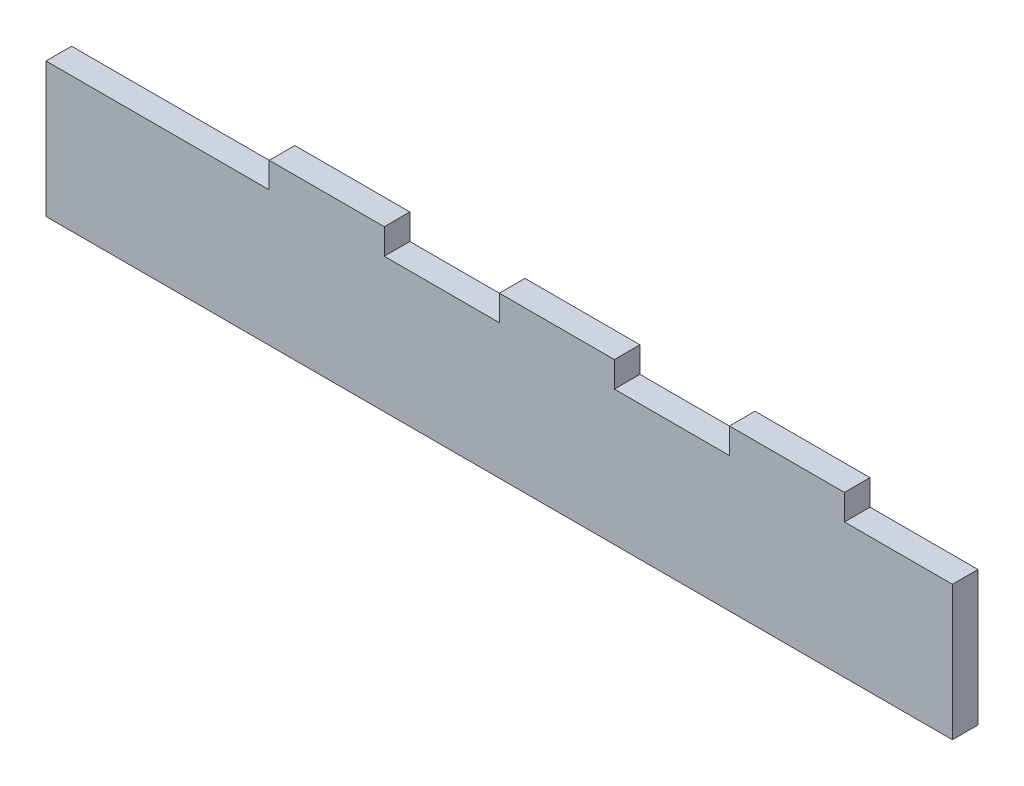
ISO-10303-21;
HEADER;
FILE_DESCRIPTION(('STEP AP214'),'2;1');
FILE_NAME('part.step','',(''),(''),'','','');
FILE_SCHEMA(('AUTOMOTIVE_DESIGN { 1 0 10303 214 1 1 1 1 }'));
ENDSEC;
DATA;
#1=APPLICATION_CONTEXT('core data for automotive mechanical design processes');
#2=APPLICATION_PROTOCOL_DEFINITION('international standard','automotive_design',2000,#1);
#3=PRODUCT_CONTEXT('',#1,'mechanical');
#4=PRODUCT('Part','Part','',(#3));
#5=PRODUCT_RELATED_PRODUCT_CATEGORY('part','',(#4));
#6=PRODUCT_DEFINITION_FORMATION('','',#4);
#7=PRODUCT_DEFINITION_CONTEXT('part definition',#1,'design');
#8=PRODUCT_DEFINITION('design','',#6,#7);
#9=PRODUCT_DEFINITION_SHAPE('','',#8);
#10=(LENGTH_UNIT() NAMED_UNIT(*) SI_UNIT(.MILLI.,.METRE.));
#11=(NAMED_UNIT(*) PLANE_ANGLE_UNIT() SI_UNIT($,.RADIAN.));
#12=(NAMED_UNIT(*) SI_UNIT($,.STERADIAN.) SOLID_ANGLE_UNIT());
#13=UNCERTAINTY_MEASURE_WITH_UNIT(LENGTH_MEASURE(1.E-05),#10,'distance_accuracy_value','');
#14=(GEOMETRIC_REPRESENTATION_CONTEXT(3) GLOBAL_UNCERTAINTY_ASSIGNED_CONTEXT((#13)) GLOBAL_UNIT_ASSIGNED_CONTEXT((#10,
#11,#12)) REPRESENTATION_CONTEXT('',''));
#15=CARTESIAN_POINT('',(0.,0.,0.));
#16=DIRECTION('',(0.,0.,1.));
#17=DIRECTION('',(1.,0.,0.));
#18=AXIS2_PLACEMENT_3D('',#15,#16,#17);
#19=CARTESIAN_POINT('',(0.,30.226,4.826));
#20=DIRECTION('',(0.,-1.,0.));
#21=DIRECTION('',(0.,0.,-1.));
#22=AXIS2_PLACEMENT_3D('',#19,#20,#21);
#23=PLANE('',#22);
#24=DIRECTION('',(-1.,0.,0.));
#25=VECTOR('',#24,1.);
#26=CARTESIAN_POINT('',(0.,30.226,4.826));
#27=LINE('',#26,#25);
#28=CARTESIAN_POINT('',(107.186691064652,30.226,4.826));
#29=VERTEX_POINT('',#28);
#30=CARTESIAN_POINT('',(85.4894913132603,30.226,4.826));
#31=VERTEX_POINT('',#30);
#32=EDGE_CURVE('E168',#29,#31,#27,.T.);
#33=ORIENTED_EDGE('',*,*,#32,.F.);
#34=DIRECTION('',(0.,0.,-1.));
#35=VECTOR('',#34,1.);
#36=CARTESIAN_POINT('',(107.186691064652,30.226,4.826));
#37=LINE('',#36,#35);
#38=CARTESIAN_POINT('',(107.186691064652,30.226,0.));
#39=VERTEX_POINT('',#38);
#40=EDGE_CURVE('E232',#29,#39,#37,.T.);
#41=ORIENTED_EDGE('',*,*,#40,.T.);
#42=DIRECTION('',(-1.,0.,0.));
#43=VECTOR('',#42,1.);
#44=CARTESIAN_POINT('',(0.,30.226,0.));
#45=LINE('',#44,#43);
#46=CARTESIAN_POINT('',(85.4894913132603,30.226,0.));
#47=VERTEX_POINT('',#46);
#48=EDGE_CURVE('E264',#39,#47,#45,.T.);
#49=ORIENTED_EDGE('',*,*,#48,.T.);
#50=DIRECTION('',(0.,0.,-1.));
#51=VECTOR('',#50,1.);
#52=CARTESIAN_POINT('',(85.4894913132603,30.226,4.826));
#53=LINE('',#52,#51);
#54=EDGE_CURVE('E209',#31,#47,#53,.T.);
#55=ORIENTED_EDGE('',*,*,#54,.F.);
#56=EDGE_LOOP('',(#33,#41,#49,#55));
#57=FACE_BOUND('',#56,.T.);
#58=ADVANCED_FACE('F33',(#57),#23,.F.);
#59=CARTESIAN_POINT('',(63.7922915618683,30.226,4.826));
#60=VERTEX_POINT('',#59);
#61=CARTESIAN_POINT('',(42.0950918104763,30.226,4.826));
#62=VERTEX_POINT('',#61);
#63=EDGE_CURVE('E170',#60,#62,#27,.T.);
#64=ORIENTED_EDGE('',*,*,#63,.F.);
#65=DIRECTION('',(0.,0.,-1.));
#66=VECTOR('',#65,1.);
#67=CARTESIAN_POINT('',(63.7922915618683,30.226,4.826));
#68=LINE('',#67,#66);
#69=CARTESIAN_POINT('',(63.7922915618683,30.226,0.));
#70=VERTEX_POINT('',#69);
#71=EDGE_CURVE('E206',#60,#70,#68,.T.);
#72=ORIENTED_EDGE('',*,*,#71,.T.);
#73=CARTESIAN_POINT('',(42.0950918104763,30.226,0.));
#74=VERTEX_POINT('',#73);
#75=EDGE_CURVE('E266',#70,#74,#45,.T.);
#76=ORIENTED_EDGE('',*,*,#75,.T.);
#77=DIRECTION('',(0.,0.,-1.));
#78=VECTOR('',#77,1.);
#79=CARTESIAN_POINT('',(42.0950918104763,30.226,4.826));
#80=LINE('',#79,#78);
#81=EDGE_CURVE('E186',#62,#74,#80,.T.);
#82=ORIENTED_EDGE('',*,*,#81,.F.);
#83=EDGE_LOOP('',(#64,#72,#76,#82));
#84=FACE_BOUND('',#83,.T.);
#85=ADVANCED_FACE('F293',(#84),#23,.F.);
#86=CARTESIAN_POINT('',(0.,0.,4.826));
#87=DIRECTION('',(1.,0.,0.));
#88=DIRECTION('',(0.,0.,-1.));
#89=AXIS2_PLACEMENT_3D('',#86,#87,#88);
#90=PLANE('',#89);
#91=DIRECTION('',(0.,-1.,0.));
#92=VECTOR('',#91,1.);
#93=CARTESIAN_POINT('',(0.,0.,4.826));
#94=LINE('',#93,#92);
#95=CARTESIAN_POINT('',(0.,25.4,4.826));
#96=VERTEX_POINT('',#95);
#97=CARTESIAN_POINT('',(0.,0.,4.826));
#98=VERTEX_POINT('',#97);
#99=EDGE_CURVE('E182',#96,#98,#94,.T.);
#100=ORIENTED_EDGE('',*,*,#99,.F.);
#101=DIRECTION('',(0.,0.,-1.));
#102=VECTOR('',#101,1.);
#103=CARTESIAN_POINT('',(0.,25.4,4.826));
#104=LINE('',#103,#102);
#105=CARTESIAN_POINT('',(0.,25.4,0.));
#106=VERTEX_POINT('',#105);
#107=EDGE_CURVE('E192',#96,#106,#104,.T.);
#108=ORIENTED_EDGE('',*,*,#107,.T.);
#109=DIRECTION('',(0.,-1.,0.));
#110=VECTOR('',#109,1.);
#111=CARTESIAN_POINT('',(0.,0.,0.));
#112=LINE('',#111,#110);
#113=CARTESIAN_POINT('',(0.,0.,0.));
#114=VERTEX_POINT('',#113);
#115=EDGE_CURVE('E195',#106,#114,#112,.T.);
#116=ORIENTED_EDGE('',*,*,#115,.T.);
#117=DIRECTION('',(0.,0.,-1.));
#118=VECTOR('',#117,1.);
#119=CARTESIAN_POINT('',(0.,0.,4.826));
#120=LINE('',#119,#118);
#121=EDGE_CURVE('E41',#98,#114,#120,.T.);
#122=ORIENTED_EDGE('',*,*,#121,.F.);
#123=EDGE_LOOP('',(#100,#108,#116,#122));
#124=FACE_BOUND('',#123,.T.);
#125=ADVANCED_FACE('F35',(#124),#90,.F.);
#126=CARTESIAN_POINT('',(0.,0.,4.826));
#127=DIRECTION('',(0.,1.,0.));
#128=DIRECTION('',(0.,0.,1.));
#129=AXIS2_PLACEMENT_3D('',#126,#127,#128);
#130=PLANE('',#129);
#131=DIRECTION('',(1.,0.,0.));
#132=VECTOR('',#131,1.);
#133=CARTESIAN_POINT('',(0.,0.,0.));
#134=LINE('',#133,#132);
#135=CARTESIAN_POINT('',(170.942,0.,0.));
#136=VERTEX_POINT('',#135);
#137=EDGE_CURVE('E272',#114,#136,#134,.T.);
#138=ORIENTED_EDGE('',*,*,#137,.T.);
#139=DIRECTION('',(0.,0.,-1.));
#140=VECTOR('',#139,1.);
#141=CARTESIAN_POINT('',(170.942,0.,4.826));
#142=LINE('',#141,#140);
#143=CARTESIAN_POINT('',(170.942,0.,4.826));
#144=VERTEX_POINT('',#143);
#145=EDGE_CURVE('E167',#144,#136,#142,.T.);
#146=ORIENTED_EDGE('',*,*,#145,.F.);
#147=DIRECTION('',(1.,0.,0.));
#148=VECTOR('',#147,1.);
#149=CARTESIAN_POINT('',(0.,0.,4.826));
#150=LINE('',#149,#148);
#151=EDGE_CURVE('E180',#98,#144,#150,.T.);
#152=ORIENTED_EDGE('',*,*,#151,.F.);
#153=ORIENTED_EDGE('',*,*,#121,.T.);
#154=EDGE_LOOP('',(#138,#146,#152,#153));
#155=FACE_BOUND('',#154,.T.);
#156=ADVANCED_FACE('F285',(#155),#130,.F.);
#157=CARTESIAN_POINT('',(170.942,0.,4.826));
#158=DIRECTION('',(-1.,0.,0.));
#159=DIRECTION('',(0.,0.,1.));
#160=AXIS2_PLACEMENT_3D('',#157,#158,#159);
#161=PLANE('',#160);
#162=DIRECTION('',(0.,1.,0.));
#163=VECTOR('',#162,1.);
#164=CARTESIAN_POINT('',(170.942,0.,0.));
#165=LINE('',#164,#163);
#166=CARTESIAN_POINT('',(170.942,25.4,0.));
#167=VERTEX_POINT('',#166);
#168=EDGE_CURVE('E268',#136,#167,#165,.T.);
#169=ORIENTED_EDGE('',*,*,#168,.T.);
#170=DIRECTION('',(0.,0.,1.));
#171=VECTOR('',#170,1.);
#172=CARTESIAN_POINT('',(170.942,25.4,4.826));
#173=LINE('',#172,#171);
#174=CARTESIAN_POINT('',(170.942,25.4,4.826));
#175=VERTEX_POINT('',#174);
#176=EDGE_CURVE('E47',#167,#175,#173,.T.);
#177=ORIENTED_EDGE('',*,*,#176,.T.);
#178=DIRECTION('',(0.,1.,0.));
#179=VECTOR('',#178,1.);
#180=CARTESIAN_POINT('',(170.942,0.,4.826));
#181=LINE('',#180,#179);
#182=EDGE_CURVE('E175',#144,#175,#181,.T.);
#183=ORIENTED_EDGE('',*,*,#182,.F.);
#184=ORIENTED_EDGE('',*,*,#145,.T.);
#185=EDGE_LOOP('',(#169,#177,#183,#184));
#186=FACE_BOUND('',#185,.T.);
#187=ADVANCED_FACE('F336',(#186),#161,.F.);
#188=CARTESIAN_POINT('',(150.581090567436,30.226,4.826));
#189=VERTEX_POINT('',#188);
#190=CARTESIAN_POINT('',(128.883890816044,30.226,4.826));
#191=VERTEX_POINT('',#190);
#192=EDGE_CURVE('E161',#189,#191,#27,.T.);
#193=ORIENTED_EDGE('',*,*,#192,.F.);
#194=DIRECTION('',(0.,0.,-1.));
#195=VECTOR('',#194,1.);
#196=CARTESIAN_POINT('',(150.581090567436,30.226,4.826));
#197=LINE('',#196,#195);
#198=CARTESIAN_POINT('',(150.581090567436,30.226,0.));
#199=VERTEX_POINT('',#198);
#200=EDGE_CURVE('E146',#189,#199,#197,.T.);
#201=ORIENTED_EDGE('',*,*,#200,.T.);
#202=CARTESIAN_POINT('',(128.883890816044,30.226,0.));
#203=VERTEX_POINT('',#202);
#204=EDGE_CURVE('E55',#199,#203,#45,.T.);
#205=ORIENTED_EDGE('',*,*,#204,.T.);
#206=DIRECTION('',(0.,0.,-1.));
#207=VECTOR('',#206,1.);
#208=CARTESIAN_POINT('',(128.883890816044,30.226,4.826));
#209=LINE('',#208,#207);
#210=EDGE_CURVE('E166',#191,#203,#209,.T.);
#211=ORIENTED_EDGE('',*,*,#210,.F.);
#212=EDGE_LOOP('',(#193,#201,#205,#211));
#213=FACE_BOUND('',#212,.T.);
#214=ADVANCED_FACE('F165',(#213),#23,.F.);
#215=CARTESIAN_POINT('',(0.,0.,4.826));
#216=DIRECTION('',(0.,0.,-1.));
#217=DIRECTION('',(-1.,0.,0.));
#218=AXIS2_PLACEMENT_3D('',#215,#216,#217);
#219=PLANE('',#218);
#220=DIRECTION('',(-1.,0.,0.));
#221=VECTOR('',#220,1.);
#222=CARTESIAN_POINT('',(150.581090567436,25.4,4.826));
#223=LINE('',#222,#221);
#224=CARTESIAN_POINT('',(150.581090567436,25.4,4.826));
#225=VERTEX_POINT('',#224);
#226=EDGE_CURVE('E156',#175,#225,#223,.T.);
#227=ORIENTED_EDGE('',*,*,#226,.T.);
#228=DIRECTION('',(0.,1.,0.));
#229=VECTOR('',#228,1.);
#230=CARTESIAN_POINT('',(150.581090567436,30.226,4.826));
#231=LINE('',#230,#229);
#232=EDGE_CURVE('E150',#225,#189,#231,.T.);
#233=ORIENTED_EDGE('',*,*,#232,.T.);
#234=ORIENTED_EDGE('',*,*,#192,.T.);
#235=DIRECTION('',(0.,-1.,0.));
#236=VECTOR('',#235,1.);
#237=CARTESIAN_POINT('',(128.883890816044,30.226,4.826));
#238=LINE('',#237,#236);
#239=CARTESIAN_POINT('',(128.883890816044,25.4,4.826));
#240=VERTEX_POINT('',#239);
#241=EDGE_CURVE('E251',#191,#240,#238,.T.);
#242=ORIENTED_EDGE('',*,*,#241,.T.);
#243=DIRECTION('',(-1.,0.,0.));
#244=VECTOR('',#243,1.);
#245=CARTESIAN_POINT('',(107.186691064652,25.4,4.826));
#246=LINE('',#245,#244);
#247=CARTESIAN_POINT('',(107.186691064652,25.4,4.826));
#248=VERTEX_POINT('',#247);
#249=EDGE_CURVE('E235',#240,#248,#246,.T.);
#250=ORIENTED_EDGE('',*,*,#249,.T.);
#251=DIRECTION('',(0.,1.,0.));
#252=VECTOR('',#251,1.);
#253=CARTESIAN_POINT('',(107.186691064652,30.226,4.826));
#254=LINE('',#253,#252);
#255=EDGE_CURVE('E243',#248,#29,#254,.T.);
#256=ORIENTED_EDGE('',*,*,#255,.T.);
#257=ORIENTED_EDGE('',*,*,#32,.T.);
#258=DIRECTION('',(0.,-1.,0.));
#259=VECTOR('',#258,1.);
#260=CARTESIAN_POINT('',(85.4894913132603,30.226,4.826));
#261=LINE('',#260,#259);
#262=CARTESIAN_POINT('',(85.4894913132603,25.4,4.826));
#263=VERTEX_POINT('',#262);
#264=EDGE_CURVE('E228',#31,#263,#261,.T.);
#265=ORIENTED_EDGE('',*,*,#264,.T.);
#266=DIRECTION('',(-1.,0.,0.));
#267=VECTOR('',#266,1.);
#268=CARTESIAN_POINT('',(63.7922915618683,25.4,4.826));
#269=LINE('',#268,#267);
#270=CARTESIAN_POINT('',(63.7922915618683,25.4,4.826));
#271=VERTEX_POINT('',#270);
#272=EDGE_CURVE('E210',#263,#271,#269,.T.);
#273=ORIENTED_EDGE('',*,*,#272,.T.);
#274=DIRECTION('',(0.,1.,0.));
#275=VECTOR('',#274,1.);
#276=CARTESIAN_POINT('',(63.7922915618683,30.226,4.826));
#277=LINE('',#276,#275);
#278=EDGE_CURVE('E219',#271,#60,#277,.T.);
#279=ORIENTED_EDGE('',*,*,#278,.T.);
#280=ORIENTED_EDGE('',*,*,#63,.T.);
#281=DIRECTION('',(0.,-1.,0.));
#282=VECTOR('',#281,1.);
#283=CARTESIAN_POINT('',(42.0950918104763,30.226,4.826));
#284=LINE('',#283,#282);
#285=CARTESIAN_POINT('',(42.0950918104763,25.4,4.826));
#286=VERTEX_POINT('',#285);
#287=EDGE_CURVE('E198',#62,#286,#284,.T.);
#288=ORIENTED_EDGE('',*,*,#287,.T.);
#289=DIRECTION('',(-1.,0.,0.));
#290=VECTOR('',#289,1.);
#291=CARTESIAN_POINT('',(0.,25.4,4.826));
#292=LINE('',#291,#290);
#293=EDGE_CURVE('E190',#286,#96,#292,.T.);
#294=ORIENTED_EDGE('',*,*,#293,.T.);
#295=ORIENTED_EDGE('',*,*,#99,.T.);
#296=ORIENTED_EDGE('',*,*,#151,.T.);
#297=ORIENTED_EDGE('',*,*,#182,.T.);
#298=EDGE_LOOP('',(#227,#233,#234,#242,#250,#256,#257,#265,#273,#279,#280,#288,#294,#295,#296,#297));
#299=FACE_BOUND('',#298,.T.);
#300=ADVANCED_FACE('F159',(#299),#219,.F.);
#301=CARTESIAN_POINT('',(0.,0.,0.));
#302=DIRECTION('',(0.,0.,-1.));
#303=DIRECTION('',(-1.,0.,0.));
#304=AXIS2_PLACEMENT_3D('',#301,#302,#303);
#305=PLANE('',#304);
#306=DIRECTION('',(0.,1.,0.));
#307=VECTOR('',#306,1.);
#308=CARTESIAN_POINT('',(150.581090567436,30.226,0.));
#309=LINE('',#308,#307);
#310=CARTESIAN_POINT('',(150.581090567436,25.4,0.));
#311=VERTEX_POINT('',#310);
#312=EDGE_CURVE('E153',#311,#199,#309,.T.);
#313=ORIENTED_EDGE('',*,*,#312,.F.);
#314=DIRECTION('',(-1.,0.,0.));
#315=VECTOR('',#314,1.);
#316=CARTESIAN_POINT('',(0.,25.4,0.));
#317=LINE('',#316,#315);
#318=EDGE_CURVE('E11',#167,#311,#317,.T.);
#319=ORIENTED_EDGE('',*,*,#318,.F.);
#320=ORIENTED_EDGE('',*,*,#168,.F.);
#321=ORIENTED_EDGE('',*,*,#137,.F.);
#322=ORIENTED_EDGE('',*,*,#115,.F.);
#323=DIRECTION('',(-1.,0.,0.));
#324=VECTOR('',#323,1.);
#325=CARTESIAN_POINT('',(0.,25.4,0.));
#326=LINE('',#325,#324);
#327=CARTESIAN_POINT('',(42.0950918104763,25.4,0.));
#328=VERTEX_POINT('',#327);
#329=EDGE_CURVE('E196',#328,#106,#326,.T.);
#330=ORIENTED_EDGE('',*,*,#329,.F.);
#331=DIRECTION('',(0.,-1.,0.));
#332=VECTOR('',#331,1.);
#333=CARTESIAN_POINT('',(42.0950918104763,30.226,0.));
#334=LINE('',#333,#332);
#335=EDGE_CURVE('E199',#74,#328,#334,.T.);
#336=ORIENTED_EDGE('',*,*,#335,.F.);
#337=ORIENTED_EDGE('',*,*,#75,.F.);
#338=DIRECTION('',(0.,1.,0.));
#339=VECTOR('',#338,1.);
#340=CARTESIAN_POINT('',(63.7922915618683,30.226,0.));
#341=LINE('',#340,#339);
#342=CARTESIAN_POINT('',(63.7922915618683,25.4,0.));
#343=VERTEX_POINT('',#342);
#344=EDGE_CURVE('E223',#343,#70,#341,.T.);
#345=ORIENTED_EDGE('',*,*,#344,.F.);
#346=DIRECTION('',(-1.,0.,0.));
#347=VECTOR('',#346,1.);
#348=CARTESIAN_POINT('',(63.7922915618683,25.4,0.));
#349=LINE('',#348,#347);
#350=CARTESIAN_POINT('',(85.4894913132603,25.4,0.));
#351=VERTEX_POINT('',#350);
#352=EDGE_CURVE('E216',#351,#343,#349,.T.);
#353=ORIENTED_EDGE('',*,*,#352,.F.);
#354=DIRECTION('',(0.,-1.,0.));
#355=VECTOR('',#354,1.);
#356=CARTESIAN_POINT('',(85.4894913132603,30.226,0.));
#357=LINE('',#356,#355);
#358=EDGE_CURVE('E220',#47,#351,#357,.T.);
#359=ORIENTED_EDGE('',*,*,#358,.F.);
#360=ORIENTED_EDGE('',*,*,#48,.F.);
#361=DIRECTION('',(0.,1.,0.));
#362=VECTOR('',#361,1.);
#363=CARTESIAN_POINT('',(107.186691064652,30.226,0.));
#364=LINE('',#363,#362);
#365=CARTESIAN_POINT('',(107.186691064652,25.4,0.));
#366=VERTEX_POINT('',#365);
#367=EDGE_CURVE('E247',#366,#39,#364,.T.);
#368=ORIENTED_EDGE('',*,*,#367,.F.);
#369=DIRECTION('',(-1.,0.,0.));
#370=VECTOR('',#369,1.);
#371=CARTESIAN_POINT('',(107.186691064652,25.4,0.));
#372=LINE('',#371,#370);
#373=CARTESIAN_POINT('',(128.883890816044,25.4,0.));
#374=VERTEX_POINT('',#373);
#375=EDGE_CURVE('E240',#374,#366,#372,.T.);
#376=ORIENTED_EDGE('',*,*,#375,.F.);
#377=DIRECTION('',(0.,-1.,0.));
#378=VECTOR('',#377,1.);
#379=CARTESIAN_POINT('',(128.883890816044,30.226,0.));
#380=LINE('',#379,#378);
#381=EDGE_CURVE('E244',#203,#374,#380,.T.);
#382=ORIENTED_EDGE('',*,*,#381,.F.);
#383=ORIENTED_EDGE('',*,*,#204,.F.);
#384=EDGE_LOOP('',(#313,#319,#320,#321,#322,#330,#336,#337,#345,#353,#359,#360,#368,#376,#382,#383));
#385=FACE_BOUND('',#384,.T.);
#386=ADVANCED_FACE('F259',(#385),#305,.T.);
#387=CARTESIAN_POINT('',(0.,25.4,4.826));
#388=DIRECTION('',(0.,-1.,0.));
#389=DIRECTION('',(0.,0.,-1.));
#390=AXIS2_PLACEMENT_3D('',#387,#388,#389);
#391=PLANE('',#390);
#392=ORIENTED_EDGE('',*,*,#329,.T.);
#393=ORIENTED_EDGE('',*,*,#107,.F.);
#394=ORIENTED_EDGE('',*,*,#293,.F.);
#395=DIRECTION('',(0.,0.,-1.));
#396=VECTOR('',#395,1.);
#397=CARTESIAN_POINT('',(42.0950918104763,25.4,4.826));
#398=LINE('',#397,#396);
#399=EDGE_CURVE('E189',#286,#328,#398,.T.);
#400=ORIENTED_EDGE('',*,*,#399,.T.);
#401=EDGE_LOOP('',(#392,#393,#394,#400));
#402=FACE_BOUND('',#401,.T.);
#403=ADVANCED_FACE('F288',(#402),#391,.F.);
#404=CARTESIAN_POINT('',(42.0950918104763,30.226,4.826));
#405=DIRECTION('',(1.,0.,0.));
#406=DIRECTION('',(0.,0.,-1.));
#407=AXIS2_PLACEMENT_3D('',#404,#405,#406);
#408=PLANE('',#407);
#409=ORIENTED_EDGE('',*,*,#335,.T.);
#410=ORIENTED_EDGE('',*,*,#399,.F.);
#411=ORIENTED_EDGE('',*,*,#287,.F.);
#412=ORIENTED_EDGE('',*,*,#81,.T.);
#413=EDGE_LOOP('',(#409,#410,#411,#412));
#414=FACE_BOUND('',#413,.T.);
#415=ADVANCED_FACE('F292',(#414),#408,.F.);
#416=CARTESIAN_POINT('',(63.7922915618683,30.226,4.826));
#417=DIRECTION('',(-1.,0.,0.));
#418=DIRECTION('',(0.,0.,1.));
#419=AXIS2_PLACEMENT_3D('',#416,#417,#418);
#420=PLANE('',#419);
#421=ORIENTED_EDGE('',*,*,#344,.T.);
#422=ORIENTED_EDGE('',*,*,#71,.F.);
#423=ORIENTED_EDGE('',*,*,#278,.F.);
#424=DIRECTION('',(0.,0.,-1.));
#425=VECTOR('',#424,1.);
#426=CARTESIAN_POINT('',(63.7922915618683,25.4,4.826));
#427=LINE('',#426,#425);
#428=EDGE_CURVE('E202',#271,#343,#427,.T.);
#429=ORIENTED_EDGE('',*,*,#428,.T.);
#430=EDGE_LOOP('',(#421,#422,#423,#429));
#431=FACE_BOUND('',#430,.T.);
#432=ADVANCED_FACE('F296',(#431),#420,.F.);
#433=CARTESIAN_POINT('',(63.7922915618683,25.4,4.826));
#434=DIRECTION('',(0.,-1.,0.));
#435=DIRECTION('',(0.,0.,-1.));
#436=AXIS2_PLACEMENT_3D('',#433,#434,#435);
#437=PLANE('',#436);
#438=ORIENTED_EDGE('',*,*,#352,.T.);
#439=ORIENTED_EDGE('',*,*,#428,.F.);
#440=ORIENTED_EDGE('',*,*,#272,.F.);
#441=DIRECTION('',(0.,0.,-1.));
#442=VECTOR('',#441,1.);
#443=CARTESIAN_POINT('',(85.4894913132603,25.4,4.826));
#444=LINE('',#443,#442);
#445=EDGE_CURVE('E213',#263,#351,#444,.T.);
#446=ORIENTED_EDGE('',*,*,#445,.T.);
#447=EDGE_LOOP('',(#438,#439,#440,#446));
#448=FACE_BOUND('',#447,.T.);
#449=ADVANCED_FACE('F300',(#448),#437,.F.);
#450=CARTESIAN_POINT('',(85.4894913132603,30.226,4.826));
#451=DIRECTION('',(1.,0.,0.));
#452=DIRECTION('',(0.,0.,-1.));
#453=AXIS2_PLACEMENT_3D('',#450,#451,#452);
#454=PLANE('',#453);
#455=ORIENTED_EDGE('',*,*,#358,.T.);
#456=ORIENTED_EDGE('',*,*,#445,.F.);
#457=ORIENTED_EDGE('',*,*,#264,.F.);
#458=ORIENTED_EDGE('',*,*,#54,.T.);
#459=EDGE_LOOP('',(#455,#456,#457,#458));
#460=FACE_BOUND('',#459,.T.);
#461=ADVANCED_FACE('F306',(#460),#454,.F.);
#462=CARTESIAN_POINT('',(107.186691064652,30.226,4.826));
#463=DIRECTION('',(-1.,0.,0.));
#464=DIRECTION('',(0.,0.,1.));
#465=AXIS2_PLACEMENT_3D('',#462,#463,#464);
#466=PLANE('',#465);
#467=ORIENTED_EDGE('',*,*,#367,.T.);
#468=ORIENTED_EDGE('',*,*,#40,.F.);
#469=ORIENTED_EDGE('',*,*,#255,.F.);
#470=DIRECTION('',(0.,0.,-1.));
#471=VECTOR('',#470,1.);
#472=CARTESIAN_POINT('',(107.186691064652,25.4,4.826));
#473=LINE('',#472,#471);
#474=EDGE_CURVE('E225',#248,#366,#473,.T.);
#475=ORIENTED_EDGE('',*,*,#474,.T.);
#476=EDGE_LOOP('',(#467,#468,#469,#475));
#477=FACE_BOUND('',#476,.T.);
#478=ADVANCED_FACE('F312',(#477),#466,.F.);
#479=CARTESIAN_POINT('',(107.186691064652,25.4,4.826));
#480=DIRECTION('',(0.,-1.,0.));
#481=DIRECTION('',(0.,0.,-1.));
#482=AXIS2_PLACEMENT_3D('',#479,#480,#481);
#483=PLANE('',#482);
#484=ORIENTED_EDGE('',*,*,#375,.T.);
#485=ORIENTED_EDGE('',*,*,#474,.F.);
#486=ORIENTED_EDGE('',*,*,#249,.F.);
#487=DIRECTION('',(0.,0.,-1.));
#488=VECTOR('',#487,1.);
#489=CARTESIAN_POINT('',(128.883890816044,25.4,4.826));
#490=LINE('',#489,#488);
#491=EDGE_CURVE('E237',#240,#374,#490,.T.);
#492=ORIENTED_EDGE('',*,*,#491,.T.);
#493=EDGE_LOOP('',(#484,#485,#486,#492));
#494=FACE_BOUND('',#493,.T.);
#495=ADVANCED_FACE('F315',(#494),#483,.F.);
#496=CARTESIAN_POINT('',(128.883890816044,30.226,4.826));
#497=DIRECTION('',(1.,0.,0.));
#498=DIRECTION('',(0.,0.,-1.));
#499=AXIS2_PLACEMENT_3D('',#496,#497,#498);
#500=PLANE('',#499);
#501=ORIENTED_EDGE('',*,*,#381,.T.);
#502=ORIENTED_EDGE('',*,*,#491,.F.);
#503=ORIENTED_EDGE('',*,*,#241,.F.);
#504=ORIENTED_EDGE('',*,*,#210,.T.);
#505=EDGE_LOOP('',(#501,#502,#503,#504));
#506=FACE_BOUND('',#505,.T.);
#507=ADVANCED_FACE('F317',(#506),#500,.F.);
#508=CARTESIAN_POINT('',(150.581090567436,25.4,4.826));
#509=DIRECTION('',(0.,-1.,0.));
#510=DIRECTION('',(0.,0.,-1.));
#511=AXIS2_PLACEMENT_3D('',#508,#509,#510);
#512=PLANE('',#511);
#513=ORIENTED_EDGE('',*,*,#318,.T.);
#514=DIRECTION('',(0.,0.,-1.));
#515=VECTOR('',#514,1.);
#516=CARTESIAN_POINT('',(150.581090567436,25.4,4.826));
#517=LINE('',#516,#515);
#518=EDGE_CURVE('E155',#225,#311,#517,.T.);
#519=ORIENTED_EDGE('',*,*,#518,.F.);
#520=ORIENTED_EDGE('',*,*,#226,.F.);
#521=ORIENTED_EDGE('',*,*,#176,.F.);
#522=EDGE_LOOP('',(#513,#519,#520,#521));
#523=FACE_BOUND('',#522,.T.);
#524=ADVANCED_FACE('F319',(#523),#512,.F.);
#525=CARTESIAN_POINT('',(150.581090567436,30.226,4.826));
#526=DIRECTION('',(-1.,0.,0.));
#527=DIRECTION('',(0.,0.,1.));
#528=AXIS2_PLACEMENT_3D('',#525,#526,#527);
#529=PLANE('',#528);
#530=ORIENTED_EDGE('',*,*,#312,.T.);
#531=ORIENTED_EDGE('',*,*,#200,.F.);
#532=ORIENTED_EDGE('',*,*,#232,.F.);
#533=ORIENTED_EDGE('',*,*,#518,.T.);
#534=EDGE_LOOP('',(#530,#531,#532,#533));
#535=FACE_BOUND('',#534,.T.);
#536=ADVANCED_FACE('F148',(#535),#529,.F.);
#537=CLOSED_SHELL('',(#58,#85,#125,#156,#187,#214,#300,#386,#403,#415,#432,#449,#461,#478,#495,
#507,#524,#536));
#538=MANIFOLD_SOLID_BREP('B2',#537);
#539=ADVANCED_BREP_SHAPE_REPRESENTATION('',(#18,#538),#14);
#540=SHAPE_DEFINITION_REPRESENTATION(#9,#539);
ENDSEC;
END-ISO-10303-21;
